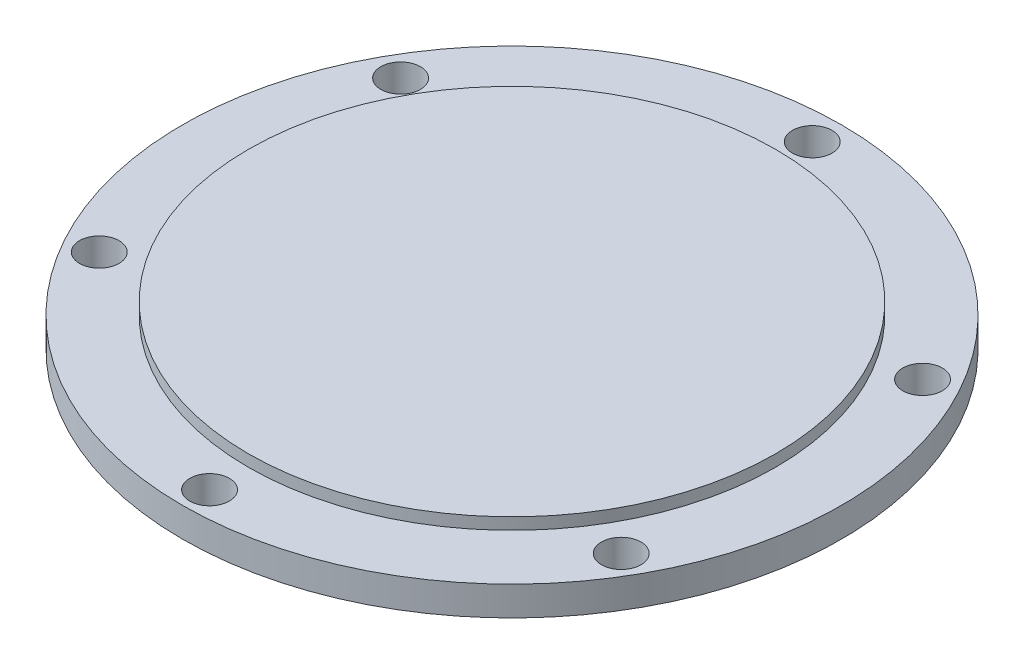
ISO-10303-21;
HEADER;
FILE_DESCRIPTION(('STEP AP214'),'2;1');
FILE_NAME('part.step','',(''),(''),'','','');
FILE_SCHEMA(('AUTOMOTIVE_DESIGN { 1 0 10303 214 1 1 1 1 }'));
ENDSEC;
DATA;
#1=APPLICATION_CONTEXT('core data for automotive mechanical design processes');
#2=APPLICATION_PROTOCOL_DEFINITION('international standard','automotive_design',2000,#1);
#3=PRODUCT_CONTEXT('',#1,'mechanical');
#4=PRODUCT('Part','Part','',(#3));
#5=PRODUCT_RELATED_PRODUCT_CATEGORY('part','',(#4));
#6=PRODUCT_DEFINITION_FORMATION('','',#4);
#7=PRODUCT_DEFINITION_CONTEXT('part definition',#1,'design');
#8=PRODUCT_DEFINITION('design','',#6,#7);
#9=PRODUCT_DEFINITION_SHAPE('','',#8);
#10=(LENGTH_UNIT() NAMED_UNIT(*) SI_UNIT(.MILLI.,.METRE.));
#11=(NAMED_UNIT(*) PLANE_ANGLE_UNIT() SI_UNIT($,.RADIAN.));
#12=(NAMED_UNIT(*) SI_UNIT($,.STERADIAN.) SOLID_ANGLE_UNIT());
#13=UNCERTAINTY_MEASURE_WITH_UNIT(LENGTH_MEASURE(1.E-05),#10,'distance_accuracy_value','');
#14=(GEOMETRIC_REPRESENTATION_CONTEXT(3) GLOBAL_UNCERTAINTY_ASSIGNED_CONTEXT((#13)) GLOBAL_UNIT_ASSIGNED_CONTEXT((#10,
#11,#12)) REPRESENTATION_CONTEXT('',''));
#15=CARTESIAN_POINT('',(0.,0.,0.));
#16=DIRECTION('',(0.,0.,1.));
#17=DIRECTION('',(1.,0.,0.));
#18=AXIS2_PLACEMENT_3D('',#15,#16,#17);
#19=CARTESIAN_POINT('',(0.,10.,0.));
#20=DIRECTION('',(0.,-1.,0.));
#21=DIRECTION('',(0.,0.,-1.));
#22=AXIS2_PLACEMENT_3D('',#19,#20,#21);
#23=CYLINDRICAL_SURFACE('',#22,112.5);
#24=CARTESIAN_POINT('',(0.,10.,0.));
#25=DIRECTION('',(0.,1.,0.));
#26=DIRECTION('',(0.,0.,1.));
#27=AXIS2_PLACEMENT_3D('',#24,#25,#26);
#28=CIRCLE('',#27,112.5);
#29=CARTESIAN_POINT('',(0.,10.,112.5));
#30=VERTEX_POINT('',#29);
#31=EDGE_CURVE('E10',#30,#30,#28,.T.);
#32=ORIENTED_EDGE('',*,*,#31,.F.);
#33=EDGE_LOOP('',(#32));
#34=FACE_BOUND('',#33,.T.);
#35=CARTESIAN_POINT('',(0.,0.,0.));
#36=DIRECTION('',(0.,1.,0.));
#37=DIRECTION('',(0.,0.,1.));
#38=AXIS2_PLACEMENT_3D('',#35,#36,#37);
#39=CIRCLE('',#38,112.5);
#40=CARTESIAN_POINT('',(0.,0.,112.5));
#41=VERTEX_POINT('',#40);
#42=EDGE_CURVE('E34',#41,#41,#39,.T.);
#43=ORIENTED_EDGE('',*,*,#42,.T.);
#44=EDGE_LOOP('',(#43));
#45=FACE_BOUND('',#44,.T.);
#46=ADVANCED_FACE('F31',(#34,#45),#23,.T.);
#47=CARTESIAN_POINT('',(0.,10.,0.));
#48=DIRECTION('',(0.,1.,0.));
#49=DIRECTION('',(0.,0.,1.));
#50=AXIS2_PLACEMENT_3D('',#47,#48,#49);
#51=PLANE('',#50);
#52=CARTESIAN_POINT('',(0.,10.,0.));
#53=DIRECTION('',(0.,1.,0.));
#54=DIRECTION('',(0.,0.,1.));
#55=AXIS2_PLACEMENT_3D('',#52,#53,#54);
#56=CIRCLE('',#55,90.);
#57=CARTESIAN_POINT('',(0.,10.,90.));
#58=VERTEX_POINT('',#57);
#59=EDGE_CURVE('E79',#58,#58,#56,.T.);
#60=ORIENTED_EDGE('',*,*,#59,.F.);
#61=EDGE_LOOP('',(#60));
#62=FACE_BOUND('',#61,.T.);
#63=CARTESIAN_POINT('',(89.088321846552,10.,-51.0648334002419));
#64=DIRECTION('',(0.,1.,0.));
#65=DIRECTION('',(0.,0.,1.));
#66=AXIS2_PLACEMENT_3D('',#63,#64,#65);
#67=CIRCLE('',#66,6.74999999999999);
#68=CARTESIAN_POINT('',(89.088321846552,10.,-44.3148334002419));
#69=VERTEX_POINT('',#68);
#70=EDGE_CURVE('E75',#69,#69,#67,.T.);
#71=ORIENTED_EDGE('',*,*,#70,.F.);
#72=EDGE_LOOP('',(#71));
#73=FACE_BOUND('',#72,.T.);
#74=CARTESIAN_POINT('',(89.0883218465531,10.,51.8054997992766));
#75=DIRECTION('',(0.,1.,0.));
#76=DIRECTION('',(0.,0.,1.));
#77=AXIS2_PLACEMENT_3D('',#74,#75,#76);
#78=CIRCLE('',#77,6.74999999999999);
#79=CARTESIAN_POINT('',(89.0883218465531,10.,58.5554997992766));
#80=VERTEX_POINT('',#79);
#81=EDGE_CURVE('E69',#80,#80,#78,.T.);
#82=ORIENTED_EDGE('',*,*,#81,.F.);
#83=EDGE_LOOP('',(#82));
#84=FACE_BOUND('',#83,.T.);
#85=CARTESIAN_POINT('',(0.,10.,103.240666399037));
#86=DIRECTION('',(0.,1.,0.));
#87=DIRECTION('',(0.,0.,1.));
#88=AXIS2_PLACEMENT_3D('',#85,#86,#87);
#89=CIRCLE('',#88,6.74999999999999);
#90=CARTESIAN_POINT('',(0.,10.,109.990666399037));
#91=VERTEX_POINT('',#90);
#92=EDGE_CURVE('E63',#91,#91,#89,.T.);
#93=ORIENTED_EDGE('',*,*,#92,.F.);
#94=EDGE_LOOP('',(#93));
#95=FACE_BOUND('',#94,.T.);
#96=CARTESIAN_POINT('',(-89.0883218465524,10.,51.8054997992779));
#97=DIRECTION('',(0.,1.,0.));
#98=DIRECTION('',(0.,0.,1.));
#99=AXIS2_PLACEMENT_3D('',#96,#97,#98);
#100=CIRCLE('',#99,6.74999999999999);
#101=CARTESIAN_POINT('',(-89.0883218465524,10.,58.5554997992779));
#102=VERTEX_POINT('',#101);
#103=EDGE_CURVE('E57',#102,#102,#100,.T.);
#104=ORIENTED_EDGE('',*,*,#103,.F.);
#105=EDGE_LOOP('',(#104));
#106=FACE_BOUND('',#105,.T.);
#107=CARTESIAN_POINT('',(-89.0883218465527,10.,-51.0648334002406));
#108=DIRECTION('',(0.,1.,0.));
#109=DIRECTION('',(0.,0.,1.));
#110=AXIS2_PLACEMENT_3D('',#107,#108,#109);
#111=CIRCLE('',#110,6.74999999999999);
#112=CARTESIAN_POINT('',(-89.0883218465527,10.,-44.3148334002406));
#113=VERTEX_POINT('',#112);
#114=EDGE_CURVE('E51',#113,#113,#111,.T.);
#115=ORIENTED_EDGE('',*,*,#114,.F.);
#116=EDGE_LOOP('',(#115));
#117=FACE_BOUND('',#116,.T.);
#118=CARTESIAN_POINT('',(0.,10.,-102.5));
#119=DIRECTION('',(0.,1.,0.));
#120=DIRECTION('',(0.,0.,1.));
#121=AXIS2_PLACEMENT_3D('',#118,#119,#120);
#122=CIRCLE('',#121,6.74999999999999);
#123=CARTESIAN_POINT('',(0.,10.,-95.75));
#124=VERTEX_POINT('',#123);
#125=EDGE_CURVE('E45',#124,#124,#122,.T.);
#126=ORIENTED_EDGE('',*,*,#125,.F.);
#127=EDGE_LOOP('',(#126));
#128=FACE_BOUND('',#127,.T.);
#129=ORIENTED_EDGE('',*,*,#31,.T.);
#130=EDGE_LOOP('',(#129));
#131=FACE_BOUND('',#130,.T.);
#132=ADVANCED_FACE('F94',(#62,#73,#84,#95,#106,#117,#128,#131),#51,.T.);
#133=CARTESIAN_POINT('',(0.,0.,0.));
#134=DIRECTION('',(0.,1.,0.));
#135=DIRECTION('',(0.,0.,1.));
#136=AXIS2_PLACEMENT_3D('',#133,#134,#135);
#137=PLANE('',#136);
#138=CARTESIAN_POINT('',(89.088321846552,0.,-51.0648334002419));
#139=DIRECTION('',(0.,1.,0.));
#140=DIRECTION('',(0.,0.,1.));
#141=AXIS2_PLACEMENT_3D('',#138,#139,#140);
#142=CIRCLE('',#141,6.74999999999998);
#143=CARTESIAN_POINT('',(89.088321846552,0.,-44.3148334002419));
#144=VERTEX_POINT('',#143);
#145=EDGE_CURVE('E72',#144,#144,#142,.T.);
#146=ORIENTED_EDGE('',*,*,#145,.T.);
#147=EDGE_LOOP('',(#146));
#148=FACE_BOUND('',#147,.T.);
#149=CARTESIAN_POINT('',(89.0883218465531,0.,51.8054997992766));
#150=DIRECTION('',(0.,1.,0.));
#151=DIRECTION('',(0.,0.,1.));
#152=AXIS2_PLACEMENT_3D('',#149,#150,#151);
#153=CIRCLE('',#152,6.74999999999998);
#154=CARTESIAN_POINT('',(89.0883218465531,0.,58.5554997992766));
#155=VERTEX_POINT('',#154);
#156=EDGE_CURVE('E66',#155,#155,#153,.T.);
#157=ORIENTED_EDGE('',*,*,#156,.T.);
#158=EDGE_LOOP('',(#157));
#159=FACE_BOUND('',#158,.T.);
#160=CARTESIAN_POINT('',(0.,0.,103.240666399037));
#161=DIRECTION('',(0.,1.,0.));
#162=DIRECTION('',(0.,0.,1.));
#163=AXIS2_PLACEMENT_3D('',#160,#161,#162);
#164=CIRCLE('',#163,6.74999999999998);
#165=CARTESIAN_POINT('',(0.,0.,109.990666399037));
#166=VERTEX_POINT('',#165);
#167=EDGE_CURVE('E60',#166,#166,#164,.T.);
#168=ORIENTED_EDGE('',*,*,#167,.T.);
#169=EDGE_LOOP('',(#168));
#170=FACE_BOUND('',#169,.T.);
#171=CARTESIAN_POINT('',(-89.0883218465524,0.,51.8054997992779));
#172=DIRECTION('',(0.,1.,0.));
#173=DIRECTION('',(0.,0.,1.));
#174=AXIS2_PLACEMENT_3D('',#171,#172,#173);
#175=CIRCLE('',#174,6.74999999999998);
#176=CARTESIAN_POINT('',(-89.0883218465524,0.,58.5554997992779));
#177=VERTEX_POINT('',#176);
#178=EDGE_CURVE('E54',#177,#177,#175,.T.);
#179=ORIENTED_EDGE('',*,*,#178,.T.);
#180=EDGE_LOOP('',(#179));
#181=FACE_BOUND('',#180,.T.);
#182=CARTESIAN_POINT('',(-89.0883218465527,0.,-51.0648334002406));
#183=DIRECTION('',(0.,1.,0.));
#184=DIRECTION('',(0.,0.,1.));
#185=AXIS2_PLACEMENT_3D('',#182,#183,#184);
#186=CIRCLE('',#185,6.74999999999998);
#187=CARTESIAN_POINT('',(-89.0883218465527,0.,-44.3148334002407));
#188=VERTEX_POINT('',#187);
#189=EDGE_CURVE('E48',#188,#188,#186,.T.);
#190=ORIENTED_EDGE('',*,*,#189,.T.);
#191=EDGE_LOOP('',(#190));
#192=FACE_BOUND('',#191,.T.);
#193=CARTESIAN_POINT('',(0.,0.,-102.5));
#194=DIRECTION('',(0.,1.,0.));
#195=DIRECTION('',(0.,0.,1.));
#196=AXIS2_PLACEMENT_3D('',#193,#194,#195);
#197=CIRCLE('',#196,6.74999999999998);
#198=CARTESIAN_POINT('',(0.,0.,-95.75));
#199=VERTEX_POINT('',#198);
#200=EDGE_CURVE('E41',#199,#199,#197,.T.);
#201=ORIENTED_EDGE('',*,*,#200,.T.);
#202=EDGE_LOOP('',(#201));
#203=FACE_BOUND('',#202,.T.);
#204=ORIENTED_EDGE('',*,*,#42,.F.);
#205=EDGE_LOOP('',(#204));
#206=FACE_BOUND('',#205,.T.);
#207=ADVANCED_FACE('F97',(#148,#159,#170,#181,#192,#203,#206),#137,.F.);
#208=CARTESIAN_POINT('',(0.,10.,-102.5));
#209=DIRECTION('',(0.,1.,0.));
#210=DIRECTION('',(0.,0.,1.));
#211=AXIS2_PLACEMENT_3D('',#208,#209,#210);
#212=CYLINDRICAL_SURFACE('',#211,6.74999999999998);
#213=ORIENTED_EDGE('',*,*,#125,.T.);
#214=EDGE_LOOP('',(#213));
#215=FACE_BOUND('',#214,.T.);
#216=ORIENTED_EDGE('',*,*,#200,.F.);
#217=EDGE_LOOP('',(#216));
#218=FACE_BOUND('',#217,.T.);
#219=ADVANCED_FACE('F111',(#215,#218),#212,.F.);
#220=CARTESIAN_POINT('',(-89.0883218465527,10.,-51.0648334002406));
#221=DIRECTION('',(0.,1.,0.));
#222=DIRECTION('',(0.,0.,1.));
#223=AXIS2_PLACEMENT_3D('',#220,#221,#222);
#224=CYLINDRICAL_SURFACE('',#223,6.74999999999998);
#225=ORIENTED_EDGE('',*,*,#114,.T.);
#226=EDGE_LOOP('',(#225));
#227=FACE_BOUND('',#226,.T.);
#228=ORIENTED_EDGE('',*,*,#189,.F.);
#229=EDGE_LOOP('',(#228));
#230=FACE_BOUND('',#229,.T.);
#231=ADVANCED_FACE('F114',(#227,#230),#224,.F.);
#232=CARTESIAN_POINT('',(-89.0883218465524,10.,51.8054997992779));
#233=DIRECTION('',(0.,1.,0.));
#234=DIRECTION('',(0.,0.,1.));
#235=AXIS2_PLACEMENT_3D('',#232,#233,#234);
#236=CYLINDRICAL_SURFACE('',#235,6.74999999999998);
#237=ORIENTED_EDGE('',*,*,#103,.T.);
#238=EDGE_LOOP('',(#237));
#239=FACE_BOUND('',#238,.T.);
#240=ORIENTED_EDGE('',*,*,#178,.F.);
#241=EDGE_LOOP('',(#240));
#242=FACE_BOUND('',#241,.T.);
#243=ADVANCED_FACE('F147',(#239,#242),#236,.F.);
#244=CARTESIAN_POINT('',(0.,10.,103.240666399037));
#245=DIRECTION('',(0.,1.,0.));
#246=DIRECTION('',(0.,0.,1.));
#247=AXIS2_PLACEMENT_3D('',#244,#245,#246);
#248=CYLINDRICAL_SURFACE('',#247,6.74999999999998);
#249=ORIENTED_EDGE('',*,*,#92,.T.);
#250=EDGE_LOOP('',(#249));
#251=FACE_BOUND('',#250,.T.);
#252=ORIENTED_EDGE('',*,*,#167,.F.);
#253=EDGE_LOOP('',(#252));
#254=FACE_BOUND('',#253,.T.);
#255=ADVANCED_FACE('F155',(#251,#254),#248,.F.);
#256=CARTESIAN_POINT('',(89.0883218465531,10.,51.8054997992766));
#257=DIRECTION('',(0.,1.,0.));
#258=DIRECTION('',(0.,0.,1.));
#259=AXIS2_PLACEMENT_3D('',#256,#257,#258);
#260=CYLINDRICAL_SURFACE('',#259,6.74999999999998);
#261=ORIENTED_EDGE('',*,*,#81,.T.);
#262=EDGE_LOOP('',(#261));
#263=FACE_BOUND('',#262,.T.);
#264=ORIENTED_EDGE('',*,*,#156,.F.);
#265=EDGE_LOOP('',(#264));
#266=FACE_BOUND('',#265,.T.);
#267=ADVANCED_FACE('F163',(#263,#266),#260,.F.);
#268=CARTESIAN_POINT('',(89.088321846552,10.,-51.0648334002419));
#269=DIRECTION('',(0.,1.,0.));
#270=DIRECTION('',(0.,0.,1.));
#271=AXIS2_PLACEMENT_3D('',#268,#269,#270);
#272=CYLINDRICAL_SURFACE('',#271,6.74999999999998);
#273=ORIENTED_EDGE('',*,*,#70,.T.);
#274=EDGE_LOOP('',(#273));
#275=FACE_BOUND('',#274,.T.);
#276=ORIENTED_EDGE('',*,*,#145,.F.);
#277=EDGE_LOOP('',(#276));
#278=FACE_BOUND('',#277,.T.);
#279=ADVANCED_FACE('F90',(#275,#278),#272,.F.);
#280=CARTESIAN_POINT('',(0.,14.,0.));
#281=DIRECTION('',(0.,-1.,0.));
#282=DIRECTION('',(0.,0.,-1.));
#283=AXIS2_PLACEMENT_3D('',#280,#281,#282);
#284=CYLINDRICAL_SURFACE('',#283,90.);
#285=CARTESIAN_POINT('',(0.,14.,0.));
#286=DIRECTION('',(0.,1.,0.));
#287=DIRECTION('',(0.,0.,1.));
#288=AXIS2_PLACEMENT_3D('',#285,#286,#287);
#289=CIRCLE('',#288,90.);
#290=CARTESIAN_POINT('',(0.,14.,90.));
#291=VERTEX_POINT('',#290);
#292=EDGE_CURVE('E78',#291,#291,#289,.T.);
#293=ORIENTED_EDGE('',*,*,#292,.F.);
#294=EDGE_LOOP('',(#293));
#295=FACE_BOUND('',#294,.T.);
#296=ORIENTED_EDGE('',*,*,#59,.T.);
#297=EDGE_LOOP('',(#296));
#298=FACE_BOUND('',#297,.T.);
#299=ADVANCED_FACE('F87',(#295,#298),#284,.T.);
#300=CARTESIAN_POINT('',(0.,14.,0.));
#301=DIRECTION('',(0.,1.,0.));
#302=DIRECTION('',(0.,0.,1.));
#303=AXIS2_PLACEMENT_3D('',#300,#301,#302);
#304=PLANE('',#303);
#305=ORIENTED_EDGE('',*,*,#292,.T.);
#306=EDGE_LOOP('',(#305));
#307=FACE_BOUND('',#306,.T.);
#308=ADVANCED_FACE('F85',(#307),#304,.T.);
#309=CLOSED_SHELL('',(#46,#132,#207,#219,#231,#243,#255,#267,#279,#299,#308));
#310=MANIFOLD_SOLID_BREP('B2',#309);
#311=ADVANCED_BREP_SHAPE_REPRESENTATION('',(#18,#310),#14);
#312=SHAPE_DEFINITION_REPRESENTATION(#9,#311);
ENDSEC;
END-ISO-10303-21;
